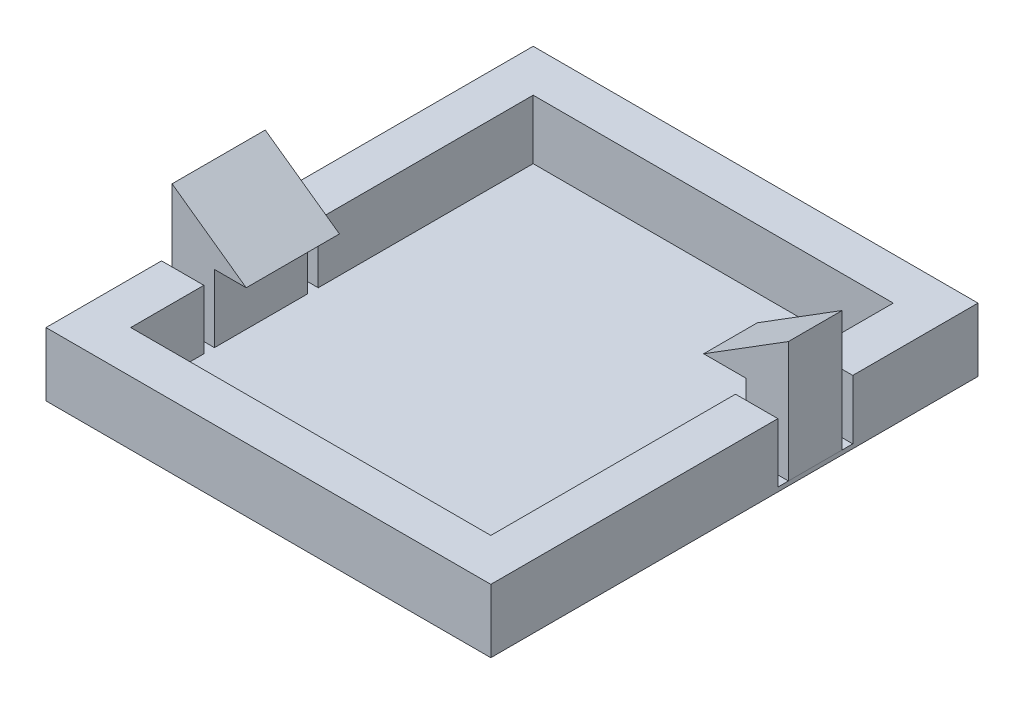
ISO-10303-21;
HEADER;
FILE_DESCRIPTION(('STEP AP214'),'2;1');
FILE_NAME('part.step','',(''),(''),'','','');
FILE_SCHEMA(('AUTOMOTIVE_DESIGN { 1 0 10303 214 1 1 1 1 }'));
ENDSEC;
DATA;
#1=APPLICATION_CONTEXT('core data for automotive mechanical design processes');
#2=APPLICATION_PROTOCOL_DEFINITION('international standard','automotive_design',2000,#1);
#3=PRODUCT_CONTEXT('',#1,'mechanical');
#4=PRODUCT('Part','Part','',(#3));
#5=PRODUCT_RELATED_PRODUCT_CATEGORY('part','',(#4));
#6=PRODUCT_DEFINITION_FORMATION('','',#4);
#7=PRODUCT_DEFINITION_CONTEXT('part definition',#1,'design');
#8=PRODUCT_DEFINITION('design','',#6,#7);
#9=PRODUCT_DEFINITION_SHAPE('','',#8);
#10=(LENGTH_UNIT() NAMED_UNIT(*) SI_UNIT(.MILLI.,.METRE.));
#11=(NAMED_UNIT(*) PLANE_ANGLE_UNIT() SI_UNIT($,.RADIAN.));
#12=(NAMED_UNIT(*) SI_UNIT($,.STERADIAN.) SOLID_ANGLE_UNIT());
#13=UNCERTAINTY_MEASURE_WITH_UNIT(LENGTH_MEASURE(1.E-05),#10,'distance_accuracy_value','');
#14=(GEOMETRIC_REPRESENTATION_CONTEXT(3) GLOBAL_UNCERTAINTY_ASSIGNED_CONTEXT((#13)) GLOBAL_UNIT_ASSIGNED_CONTEXT((#10,
#11,#12)) REPRESENTATION_CONTEXT('',''));
#15=CARTESIAN_POINT('',(0.,0.,0.));
#16=DIRECTION('',(0.,0.,1.));
#17=DIRECTION('',(1.,0.,0.));
#18=AXIS2_PLACEMENT_3D('',#15,#16,#17);
#19=CARTESIAN_POINT('',(0.,0.2,0.));
#20=DIRECTION('',(0.,1.,0.));
#21=DIRECTION('',(0.,0.,1.));
#22=AXIS2_PLACEMENT_3D('',#19,#20,#21);
#23=PLANE('',#22);
#24=DIRECTION('',(-1.,0.,0.));
#25=VECTOR('',#24,1.);
#26=CARTESIAN_POINT('',(-10.5010455856569,0.2,1.14755011022584));
#27=LINE('',#26,#25);
#28=CARTESIAN_POINT('',(-8.50104558565693,0.2,1.14755011022584));
#29=VERTEX_POINT('',#28);
#30=CARTESIAN_POINT('',(-10.5005227928285,0.2,1.14755011022584));
#31=VERTEX_POINT('',#30);
#32=EDGE_CURVE('E470',#29,#31,#27,.T.);
#33=ORIENTED_EDGE('',*,*,#32,.F.);
#34=DIRECTION('',(0.,0.,-1.));
#35=VECTOR('',#34,1.);
#36=CARTESIAN_POINT('',(-8.50104558565693,0.2,1.14755011022584));
#37=LINE('',#36,#35);
#38=CARTESIAN_POINT('',(-8.50104558565693,0.2,5.54648062378902));
#39=VERTEX_POINT('',#38);
#40=EDGE_CURVE('E466',#39,#29,#37,.T.);
#41=ORIENTED_EDGE('',*,*,#40,.F.);
#42=DIRECTION('',(1.,0.,0.));
#43=VECTOR('',#42,1.);
#44=CARTESIAN_POINT('',(-10.5010455856569,0.2,5.54648062378902));
#45=LINE('',#44,#43);
#46=CARTESIAN_POINT('',(-10.5005227928285,0.2,5.54648062378902));
#47=VERTEX_POINT('',#46);
#48=EDGE_CURVE('E469',#47,#39,#45,.T.);
#49=ORIENTED_EDGE('',*,*,#48,.F.);
#50=DIRECTION('',(0.,0.,1.));
#51=VECTOR('',#50,1.);
#52=CARTESIAN_POINT('',(-10.5,0.2,0.));
#53=LINE('',#52,#51);
#54=CARTESIAN_POINT('',(-10.5,0.2,6.04648062378904));
#55=VERTEX_POINT('',#54);
#56=EDGE_CURVE('E241',#47,#55,#53,.T.);
#57=ORIENTED_EDGE('',*,*,#56,.T.);
#58=DIRECTION('',(-1.,0.,0.));
#59=VECTOR('',#58,1.);
#60=CARTESIAN_POINT('',(-10.5,0.2,6.04648062378904));
#61=LINE('',#60,#59);
#62=CARTESIAN_POINT('',(-8.5,0.2,6.04648062378904));
#63=VERTEX_POINT('',#62);
#64=EDGE_CURVE('E275',#63,#55,#61,.T.);
#65=ORIENTED_EDGE('',*,*,#64,.F.);
#66=DIRECTION('',(0.,0.,-1.));
#67=VECTOR('',#66,1.);
#68=CARTESIAN_POINT('',(-8.5,0.2,9.5));
#69=LINE('',#68,#67);
#70=CARTESIAN_POINT('',(-8.5,0.2,9.5));
#71=VERTEX_POINT('',#70);
#72=EDGE_CURVE('E269',#71,#63,#69,.T.);
#73=ORIENTED_EDGE('',*,*,#72,.F.);
#74=DIRECTION('',(-1.,0.,0.));
#75=VECTOR('',#74,1.);
#76=CARTESIAN_POINT('',(-8.5,0.2,9.5));
#77=LINE('',#76,#75);
#78=CARTESIAN_POINT('',(8.5,0.2,9.5));
#79=VERTEX_POINT('',#78);
#80=EDGE_CURVE('E164',#79,#71,#77,.T.);
#81=ORIENTED_EDGE('',*,*,#80,.F.);
#82=DIRECTION('',(0.,0.,1.));
#83=VECTOR('',#82,1.);
#84=CARTESIAN_POINT('',(8.5,0.2,9.5));
#85=LINE('',#84,#83);
#86=CARTESIAN_POINT('',(8.5,0.2,-2.05191514655576));
#87=VERTEX_POINT('',#86);
#88=EDGE_CURVE('E270',#87,#79,#85,.T.);
#89=ORIENTED_EDGE('',*,*,#88,.F.);
#90=DIRECTION('',(-1.,0.,0.));
#91=VECTOR('',#90,1.);
#92=CARTESIAN_POINT('',(8.5,0.2,-2.05191514655576));
#93=LINE('',#92,#91);
#94=CARTESIAN_POINT('',(10.5,0.2,-2.05191514655576));
#95=VERTEX_POINT('',#94);
#96=EDGE_CURVE('E267',#95,#87,#93,.T.);
#97=ORIENTED_EDGE('',*,*,#96,.F.);
#98=DIRECTION('',(0.,0.,1.));
#99=VECTOR('',#98,1.);
#100=CARTESIAN_POINT('',(10.5,0.2,0.));
#101=LINE('',#100,#99);
#102=CARTESIAN_POINT('',(10.4982568853822,0.2,-2.55191514655576));
#103=VERTEX_POINT('',#102);
#104=EDGE_CURVE('E232',#95,#103,#101,.F.);
#105=ORIENTED_EDGE('',*,*,#104,.T.);
#106=DIRECTION('',(1.,0.,0.));
#107=VECTOR('',#106,1.);
#108=CARTESIAN_POINT('',(10.4965137707645,0.2,-2.55191514655575));
#109=LINE('',#108,#107);
#110=CARTESIAN_POINT('',(8.49651377076446,0.2,-2.55191514655575));
#111=VERTEX_POINT('',#110);
#112=EDGE_CURVE('E425',#111,#103,#109,.T.);
#113=ORIENTED_EDGE('',*,*,#112,.F.);
#114=DIRECTION('',(0.,0.,1.));
#115=VECTOR('',#114,1.);
#116=CARTESIAN_POINT('',(8.49651377076446,0.2,-5.08783442656546));
#117=LINE('',#116,#115);
#118=CARTESIAN_POINT('',(8.49651377076446,0.2,-5.08783442656546));
#119=VERTEX_POINT('',#118);
#120=EDGE_CURVE('E479',#119,#111,#117,.T.);
#121=ORIENTED_EDGE('',*,*,#120,.F.);
#122=DIRECTION('',(-1.,0.,0.));
#123=VECTOR('',#122,1.);
#124=CARTESIAN_POINT('',(10.4965137707645,0.2,-5.08783442656546));
#125=LINE('',#124,#123);
#126=CARTESIAN_POINT('',(10.4982568853822,0.2,-5.08783442656546));
#127=VERTEX_POINT('',#126);
#128=EDGE_CURVE('E481',#127,#119,#125,.T.);
#129=ORIENTED_EDGE('',*,*,#128,.F.);
#130=DIRECTION('',(0.,0.,1.));
#131=VECTOR('',#130,1.);
#132=CARTESIAN_POINT('',(10.5,0.2,0.));
#133=LINE('',#132,#131);
#134=CARTESIAN_POINT('',(10.5,0.2,-5.58783442656546));
#135=VERTEX_POINT('',#134);
#136=EDGE_CURVE('E240',#127,#135,#133,.F.);
#137=ORIENTED_EDGE('',*,*,#136,.T.);
#138=DIRECTION('',(-1.,0.,0.));
#139=VECTOR('',#138,1.);
#140=CARTESIAN_POINT('',(0.,0.2,-5.58783442656546));
#141=LINE('',#140,#139);
#142=CARTESIAN_POINT('',(8.5,0.2,-5.58783442656546));
#143=VERTEX_POINT('',#142);
#144=EDGE_CURVE('E11',#135,#143,#141,.T.);
#145=ORIENTED_EDGE('',*,*,#144,.T.);
#146=DIRECTION('',(0.,0.,-1.));
#147=VECTOR('',#146,1.);
#148=CARTESIAN_POINT('',(8.5,0.2,0.));
#149=LINE('',#148,#147);
#150=CARTESIAN_POINT('',(8.5,0.2,-9.5));
#151=VERTEX_POINT('',#150);
#152=EDGE_CURVE('E47',#143,#151,#149,.T.);
#153=ORIENTED_EDGE('',*,*,#152,.T.);
#154=DIRECTION('',(-1.,0.,0.));
#155=VECTOR('',#154,1.);
#156=CARTESIAN_POINT('',(0.,0.2,-9.5));
#157=LINE('',#156,#155);
#158=CARTESIAN_POINT('',(-8.5,0.2,-9.5));
#159=VERTEX_POINT('',#158);
#160=EDGE_CURVE('E146',#151,#159,#157,.T.);
#161=ORIENTED_EDGE('',*,*,#160,.T.);
#162=DIRECTION('',(0.,0.,1.));
#163=VECTOR('',#162,1.);
#164=CARTESIAN_POINT('',(-8.5,0.2,0.));
#165=LINE('',#164,#163);
#166=CARTESIAN_POINT('',(-8.5,0.2,0.647550110225836));
#167=VERTEX_POINT('',#166);
#168=EDGE_CURVE('E157',#159,#167,#165,.T.);
#169=ORIENTED_EDGE('',*,*,#168,.T.);
#170=DIRECTION('',(-1.,0.,0.));
#171=VECTOR('',#170,1.);
#172=CARTESIAN_POINT('',(0.,0.2,0.647550110225836));
#173=LINE('',#172,#171);
#174=CARTESIAN_POINT('',(-10.5,0.2,0.647550110225836));
#175=VERTEX_POINT('',#174);
#176=EDGE_CURVE('E82',#167,#175,#173,.T.);
#177=ORIENTED_EDGE('',*,*,#176,.T.);
#178=DIRECTION('',(0.,0.,1.));
#179=VECTOR('',#178,1.);
#180=CARTESIAN_POINT('',(-10.5,0.2,0.));
#181=LINE('',#180,#179);
#182=EDGE_CURVE('E242',#175,#31,#181,.T.);
#183=ORIENTED_EDGE('',*,*,#182,.T.);
#184=EDGE_LOOP('',(#33,#41,#49,#57,#65,#73,#81,#89,#97,#105,#113,#121,#129,#137,#145,#153,#161,
#169,#177,#183));
#185=FACE_BOUND('',#184,.T.);
#186=ADVANCED_FACE('F39',(#185),#23,.T.);
#187=CARTESIAN_POINT('',(-8.5,3.,9.5));
#188=DIRECTION('',(-1.,0.,0.));
#189=DIRECTION('',(0.,0.,1.));
#190=AXIS2_PLACEMENT_3D('',#187,#188,#189);
#191=PLANE('',#190);
#192=DIRECTION('',(0.,-1.,0.));
#193=VECTOR('',#192,1.);
#194=CARTESIAN_POINT('',(-8.5,3.,9.5));
#195=LINE('',#194,#193);
#196=CARTESIAN_POINT('',(-8.5,3.,9.5));
#197=VERTEX_POINT('',#196);
#198=EDGE_CURVE('E290',#197,#71,#195,.T.);
#199=ORIENTED_EDGE('',*,*,#198,.T.);
#200=ORIENTED_EDGE('',*,*,#72,.T.);
#201=DIRECTION('',(0.,-1.,0.));
#202=VECTOR('',#201,1.);
#203=CARTESIAN_POINT('',(-8.5,3.,6.04648062378904));
#204=LINE('',#203,#202);
#205=CARTESIAN_POINT('',(-8.5,3.,6.04648062378904));
#206=VERTEX_POINT('',#205);
#207=EDGE_CURVE('E272',#206,#63,#204,.T.);
#208=ORIENTED_EDGE('',*,*,#207,.F.);
#209=DIRECTION('',(0.,0.,-1.));
#210=VECTOR('',#209,1.);
#211=CARTESIAN_POINT('',(-8.5,3.,9.5));
#212=LINE('',#211,#210);
#213=EDGE_CURVE('E294',#197,#206,#212,.T.);
#214=ORIENTED_EDGE('',*,*,#213,.F.);
#215=EDGE_LOOP('',(#199,#200,#208,#214));
#216=FACE_BOUND('',#215,.T.);
#217=ADVANCED_FACE('F318',(#216),#191,.F.);
#218=CARTESIAN_POINT('',(-10.5,3.,6.04648062378904));
#219=DIRECTION('',(0.,0.,1.));
#220=DIRECTION('',(1.,0.,0.));
#221=AXIS2_PLACEMENT_3D('',#218,#219,#220);
#222=PLANE('',#221);
#223=ORIENTED_EDGE('',*,*,#207,.T.);
#224=ORIENTED_EDGE('',*,*,#64,.T.);
#225=DIRECTION('',(0.,-1.,0.));
#226=VECTOR('',#225,1.);
#227=CARTESIAN_POINT('',(-10.5,3.,6.04648062378904));
#228=LINE('',#227,#226);
#229=CARTESIAN_POINT('',(-10.5,3.,6.04648062378904));
#230=VERTEX_POINT('',#229);
#231=EDGE_CURVE('E210',#230,#55,#228,.T.);
#232=ORIENTED_EDGE('',*,*,#231,.F.);
#233=DIRECTION('',(-1.,0.,0.));
#234=VECTOR('',#233,1.);
#235=CARTESIAN_POINT('',(-10.5,3.,6.04648062378904));
#236=LINE('',#235,#234);
#237=EDGE_CURVE('E310',#206,#230,#236,.T.);
#238=ORIENTED_EDGE('',*,*,#237,.F.);
#239=EDGE_LOOP('',(#223,#224,#232,#238));
#240=FACE_BOUND('',#239,.T.);
#241=ADVANCED_FACE('F189',(#240),#222,.F.);
#242=CARTESIAN_POINT('',(-10.5,3.,11.5));
#243=DIRECTION('',(1.,0.,0.));
#244=DIRECTION('',(0.,0.,-1.));
#245=AXIS2_PLACEMENT_3D('',#242,#243,#244);
#246=PLANE('',#245);
#247=ORIENTED_EDGE('',*,*,#182,.F.);
#248=DIRECTION('',(0.,-1.,0.));
#249=VECTOR('',#248,1.);
#250=CARTESIAN_POINT('',(-10.5,3.,0.647550110225836));
#251=LINE('',#250,#249);
#252=CARTESIAN_POINT('',(-10.5,3.,0.647550110225836));
#253=VERTEX_POINT('',#252);
#254=EDGE_CURVE('E79',#253,#175,#251,.T.);
#255=ORIENTED_EDGE('',*,*,#254,.F.);
#256=DIRECTION('',(0.,0.,1.));
#257=VECTOR('',#256,1.);
#258=CARTESIAN_POINT('',(-10.5,3.,0.647550110225836));
#259=LINE('',#258,#257);
#260=CARTESIAN_POINT('',(-10.5,3.,-11.5));
#261=VERTEX_POINT('',#260);
#262=EDGE_CURVE('E330',#261,#253,#259,.T.);
#263=ORIENTED_EDGE('',*,*,#262,.F.);
#264=DIRECTION('',(0.,-1.,0.));
#265=VECTOR('',#264,1.);
#266=CARTESIAN_POINT('',(-10.5,0.2,-11.5));
#267=LINE('',#266,#265);
#268=CARTESIAN_POINT('',(-10.5,0.,-11.5));
#269=VERTEX_POINT('',#268);
#270=EDGE_CURVE('E237',#261,#269,#267,.T.);
#271=ORIENTED_EDGE('',*,*,#270,.T.);
#272=DIRECTION('',(0.,0.,1.));
#273=VECTOR('',#272,1.);
#274=CARTESIAN_POINT('',(-10.5,0.,11.5));
#275=LINE('',#274,#273);
#276=CARTESIAN_POINT('',(-10.5,0.,11.5));
#277=VERTEX_POINT('',#276);
#278=EDGE_CURVE('E170',#269,#277,#275,.T.);
#279=ORIENTED_EDGE('',*,*,#278,.T.);
#280=DIRECTION('',(0.,-1.,0.));
#281=VECTOR('',#280,1.);
#282=CARTESIAN_POINT('',(-10.5,3.,11.5));
#283=LINE('',#282,#281);
#284=CARTESIAN_POINT('',(-10.5,3.,11.5));
#285=VERTEX_POINT('',#284);
#286=EDGE_CURVE('E277',#285,#277,#283,.T.);
#287=ORIENTED_EDGE('',*,*,#286,.F.);
#288=DIRECTION('',(0.,0.,1.));
#289=VECTOR('',#288,1.);
#290=CARTESIAN_POINT('',(-10.5,3.,11.5));
#291=LINE('',#290,#289);
#292=EDGE_CURVE('E307',#230,#285,#291,.T.);
#293=ORIENTED_EDGE('',*,*,#292,.F.);
#294=ORIENTED_EDGE('',*,*,#231,.T.);
#295=ORIENTED_EDGE('',*,*,#56,.F.);
#296=CARTESIAN_POINT('',(-10.5010455856569,0.2,1.14755011022584));
#297=DIRECTION('',(0.,0.,1.));
#298=VECTOR('',#297,1.);
#299=LINE('',#296,#298);
#300=EDGE_CURVE('E235',#31,#47,#299,.T.);
#301=ORIENTED_EDGE('',*,*,#300,.F.);
#302=EDGE_LOOP('',(#247,#255,#263,#271,#279,#287,#293,#294,#295,#301));
#303=FACE_BOUND('',#302,.T.);
#304=ADVANCED_FACE('F176',(#303),#246,.F.);
#305=CARTESIAN_POINT('',(-10.5,3.,11.5));
#306=DIRECTION('',(0.,0.,-1.));
#307=DIRECTION('',(-1.,0.,0.));
#308=AXIS2_PLACEMENT_3D('',#305,#306,#307);
#309=PLANE('',#308);
#310=ORIENTED_EDGE('',*,*,#286,.T.);
#311=DIRECTION('',(1.,0.,0.));
#312=VECTOR('',#311,1.);
#313=CARTESIAN_POINT('',(-10.5,0.,11.5));
#314=LINE('',#313,#312);
#315=CARTESIAN_POINT('',(10.5,0.,11.5));
#316=VERTEX_POINT('',#315);
#317=EDGE_CURVE('E291',#277,#316,#314,.T.);
#318=ORIENTED_EDGE('',*,*,#317,.T.);
#319=DIRECTION('',(0.,-1.,0.));
#320=VECTOR('',#319,1.);
#321=CARTESIAN_POINT('',(10.5,3.,11.5));
#322=LINE('',#321,#320);
#323=CARTESIAN_POINT('',(10.5,3.,11.5));
#324=VERTEX_POINT('',#323);
#325=EDGE_CURVE('E276',#324,#316,#322,.T.);
#326=ORIENTED_EDGE('',*,*,#325,.F.);
#327=DIRECTION('',(1.,0.,0.));
#328=VECTOR('',#327,1.);
#329=CARTESIAN_POINT('',(-10.5,3.,11.5));
#330=LINE('',#329,#328);
#331=EDGE_CURVE('E304',#285,#324,#330,.T.);
#332=ORIENTED_EDGE('',*,*,#331,.F.);
#333=EDGE_LOOP('',(#310,#318,#326,#332));
#334=FACE_BOUND('',#333,.T.);
#335=ADVANCED_FACE('F188',(#334),#309,.F.);
#336=CARTESIAN_POINT('',(10.5,3.,11.5));
#337=DIRECTION('',(-1.,0.,0.));
#338=DIRECTION('',(0.,0.,1.));
#339=AXIS2_PLACEMENT_3D('',#336,#337,#338);
#340=PLANE('',#339);
#341=DIRECTION('',(0.,-1.,0.));
#342=VECTOR('',#341,1.);
#343=CARTESIAN_POINT('',(10.5,0.2,-11.5));
#344=LINE('',#343,#342);
#345=CARTESIAN_POINT('',(10.5,3.,-11.5));
#346=VERTEX_POINT('',#345);
#347=CARTESIAN_POINT('',(10.5,0.,-11.5));
#348=VERTEX_POINT('',#347);
#349=EDGE_CURVE('E264',#346,#348,#344,.T.);
#350=ORIENTED_EDGE('',*,*,#349,.F.);
#351=DIRECTION('',(0.,0.,-1.));
#352=VECTOR('',#351,1.);
#353=CARTESIAN_POINT('',(10.5,3.,-5.58783442656546));
#354=LINE('',#353,#352);
#355=CARTESIAN_POINT('',(10.5,3.,-5.58783442656546));
#356=VERTEX_POINT('',#355);
#357=EDGE_CURVE('E536',#356,#346,#354,.T.);
#358=ORIENTED_EDGE('',*,*,#357,.F.);
#359=DIRECTION('',(0.,-1.,0.));
#360=VECTOR('',#359,1.);
#361=CARTESIAN_POINT('',(10.5,3.,-5.58783442656546));
#362=LINE('',#361,#360);
#363=EDGE_CURVE('E223',#356,#135,#362,.T.);
#364=ORIENTED_EDGE('',*,*,#363,.T.);
#365=ORIENTED_EDGE('',*,*,#136,.F.);
#366=CARTESIAN_POINT('',(10.4965137707645,0.2,-2.55191514655575));
#367=DIRECTION('',(0.,0.,-1.));
#368=VECTOR('',#367,1.);
#369=LINE('',#366,#368);
#370=EDGE_CURVE('E224',#103,#127,#369,.T.);
#371=ORIENTED_EDGE('',*,*,#370,.F.);
#372=ORIENTED_EDGE('',*,*,#104,.F.);
#373=DIRECTION('',(0.,-1.,0.));
#374=VECTOR('',#373,1.);
#375=CARTESIAN_POINT('',(10.5,3.,-2.05191514655576));
#376=LINE('',#375,#374);
#377=CARTESIAN_POINT('',(10.5,3.,-2.05191514655576));
#378=VERTEX_POINT('',#377);
#379=EDGE_CURVE('E207',#378,#95,#376,.T.);
#380=ORIENTED_EDGE('',*,*,#379,.F.);
#381=DIRECTION('',(0.,0.,-1.));
#382=VECTOR('',#381,1.);
#383=CARTESIAN_POINT('',(10.5,3.,11.5));
#384=LINE('',#383,#382);
#385=EDGE_CURVE('E301',#324,#378,#384,.T.);
#386=ORIENTED_EDGE('',*,*,#385,.F.);
#387=ORIENTED_EDGE('',*,*,#325,.T.);
#388=DIRECTION('',(0.,0.,-1.));
#389=VECTOR('',#388,1.);
#390=CARTESIAN_POINT('',(10.5,0.,11.5));
#391=LINE('',#390,#389);
#392=EDGE_CURVE('E292',#316,#348,#391,.T.);
#393=ORIENTED_EDGE('',*,*,#392,.T.);
#394=EDGE_LOOP('',(#350,#358,#364,#365,#371,#372,#380,#386,#387,#393));
#395=FACE_BOUND('',#394,.T.);
#396=ADVANCED_FACE('F192',(#395),#340,.F.);
#397=CARTESIAN_POINT('',(8.5,3.,-2.05191514655576));
#398=DIRECTION('',(0.,0.,1.));
#399=DIRECTION('',(1.,0.,0.));
#400=AXIS2_PLACEMENT_3D('',#397,#398,#399);
#401=PLANE('',#400);
#402=ORIENTED_EDGE('',*,*,#379,.T.);
#403=ORIENTED_EDGE('',*,*,#96,.T.);
#404=DIRECTION('',(0.,-1.,0.));
#405=VECTOR('',#404,1.);
#406=CARTESIAN_POINT('',(8.5,3.,-2.05191514655576));
#407=LINE('',#406,#405);
#408=CARTESIAN_POINT('',(8.5,3.,-2.05191514655576));
#409=VERTEX_POINT('',#408);
#410=EDGE_CURVE('E282',#409,#87,#407,.T.);
#411=ORIENTED_EDGE('',*,*,#410,.F.);
#412=DIRECTION('',(-1.,0.,0.));
#413=VECTOR('',#412,1.);
#414=CARTESIAN_POINT('',(8.5,3.,-2.05191514655576));
#415=LINE('',#414,#413);
#416=EDGE_CURVE('E303',#378,#409,#415,.T.);
#417=ORIENTED_EDGE('',*,*,#416,.F.);
#418=EDGE_LOOP('',(#402,#403,#411,#417));
#419=FACE_BOUND('',#418,.T.);
#420=ADVANCED_FACE('F200',(#419),#401,.F.);
#421=CARTESIAN_POINT('',(8.5,3.,9.5));
#422=DIRECTION('',(1.,0.,0.));
#423=DIRECTION('',(0.,0.,-1.));
#424=AXIS2_PLACEMENT_3D('',#421,#422,#423);
#425=PLANE('',#424);
#426=ORIENTED_EDGE('',*,*,#410,.T.);
#427=ORIENTED_EDGE('',*,*,#88,.T.);
#428=DIRECTION('',(0.,-1.,0.));
#429=VECTOR('',#428,1.);
#430=CARTESIAN_POINT('',(8.5,3.,9.5));
#431=LINE('',#430,#429);
#432=CARTESIAN_POINT('',(8.5,3.,9.5));
#433=VERTEX_POINT('',#432);
#434=EDGE_CURVE('E284',#433,#79,#431,.T.);
#435=ORIENTED_EDGE('',*,*,#434,.F.);
#436=DIRECTION('',(0.,0.,1.));
#437=VECTOR('',#436,1.);
#438=CARTESIAN_POINT('',(8.5,3.,9.5));
#439=LINE('',#438,#437);
#440=EDGE_CURVE('E299',#409,#433,#439,.T.);
#441=ORIENTED_EDGE('',*,*,#440,.F.);
#442=EDGE_LOOP('',(#426,#427,#435,#441));
#443=FACE_BOUND('',#442,.T.);
#444=ADVANCED_FACE('F556',(#443),#425,.F.);
#445=CARTESIAN_POINT('',(-8.5,3.,9.5));
#446=DIRECTION('',(0.,0.,1.));
#447=DIRECTION('',(1.,0.,0.));
#448=AXIS2_PLACEMENT_3D('',#445,#446,#447);
#449=PLANE('',#448);
#450=ORIENTED_EDGE('',*,*,#434,.T.);
#451=ORIENTED_EDGE('',*,*,#80,.T.);
#452=ORIENTED_EDGE('',*,*,#198,.F.);
#453=DIRECTION('',(-1.,0.,0.));
#454=VECTOR('',#453,1.);
#455=CARTESIAN_POINT('',(-8.5,3.,9.5));
#456=LINE('',#455,#454);
#457=EDGE_CURVE('E289',#433,#197,#456,.T.);
#458=ORIENTED_EDGE('',*,*,#457,.F.);
#459=EDGE_LOOP('',(#450,#451,#452,#458));
#460=FACE_BOUND('',#459,.T.);
#461=ADVANCED_FACE('F565',(#460),#449,.F.);
#462=CARTESIAN_POINT('',(0.,3.,0.));
#463=DIRECTION('',(0.,-1.,0.));
#464=DIRECTION('',(0.,0.,-1.));
#465=AXIS2_PLACEMENT_3D('',#462,#463,#464);
#466=PLANE('',#465);
#467=ORIENTED_EDGE('',*,*,#213,.T.);
#468=ORIENTED_EDGE('',*,*,#237,.T.);
#469=ORIENTED_EDGE('',*,*,#292,.T.);
#470=ORIENTED_EDGE('',*,*,#331,.T.);
#471=ORIENTED_EDGE('',*,*,#385,.T.);
#472=ORIENTED_EDGE('',*,*,#416,.T.);
#473=ORIENTED_EDGE('',*,*,#440,.T.);
#474=ORIENTED_EDGE('',*,*,#457,.T.);
#475=EDGE_LOOP('',(#467,#468,#469,#470,#471,#472,#473,#474));
#476=FACE_BOUND('',#475,.T.);
#477=ADVANCED_FACE('F41',(#476),#466,.F.);
#478=CARTESIAN_POINT('',(0.,0.,0.));
#479=DIRECTION('',(0.,-1.,0.));
#480=DIRECTION('',(0.,0.,-1.));
#481=AXIS2_PLACEMENT_3D('',#478,#479,#480);
#482=PLANE('',#481);
#483=DIRECTION('',(-1.,0.,0.));
#484=VECTOR('',#483,1.);
#485=CARTESIAN_POINT('',(-10.5,0.,-11.5));
#486=LINE('',#485,#484);
#487=EDGE_CURVE('E246',#348,#269,#486,.T.);
#488=ORIENTED_EDGE('',*,*,#487,.F.);
#489=ORIENTED_EDGE('',*,*,#392,.F.);
#490=ORIENTED_EDGE('',*,*,#317,.F.);
#491=ORIENTED_EDGE('',*,*,#278,.F.);
#492=EDGE_LOOP('',(#488,#489,#490,#491));
#493=FACE_BOUND('',#492,.T.);
#494=ADVANCED_FACE('F548',(#493),#482,.T.);
#495=CARTESIAN_POINT('',(-10.5,0.2,-11.5));
#496=DIRECTION('',(0.,0.,1.));
#497=DIRECTION('',(1.,0.,0.));
#498=AXIS2_PLACEMENT_3D('',#495,#496,#497);
#499=PLANE('',#498);
#500=ORIENTED_EDGE('',*,*,#487,.T.);
#501=ORIENTED_EDGE('',*,*,#270,.F.);
#502=DIRECTION('',(-1.,0.,0.));
#503=VECTOR('',#502,1.);
#504=CARTESIAN_POINT('',(-10.5,3.,-11.5));
#505=LINE('',#504,#503);
#506=EDGE_CURVE('E338',#346,#261,#505,.T.);
#507=ORIENTED_EDGE('',*,*,#506,.F.);
#508=ORIENTED_EDGE('',*,*,#349,.T.);
#509=EDGE_LOOP('',(#500,#501,#507,#508));
#510=FACE_BOUND('',#509,.T.);
#511=ADVANCED_FACE('F541',(#510),#499,.F.);
#512=CARTESIAN_POINT('',(8.5,3.,-5.58783442656546));
#513=DIRECTION('',(1.,0.,0.));
#514=DIRECTION('',(0.,0.,-1.));
#515=AXIS2_PLACEMENT_3D('',#512,#513,#514);
#516=PLANE('',#515);
#517=ORIENTED_EDGE('',*,*,#152,.F.);
#518=DIRECTION('',(0.,-1.,0.));
#519=VECTOR('',#518,1.);
#520=CARTESIAN_POINT('',(8.5,3.,-5.58783442656546));
#521=LINE('',#520,#519);
#522=CARTESIAN_POINT('',(8.5,3.,-5.58783442656546));
#523=VERTEX_POINT('',#522);
#524=EDGE_CURVE('E251',#523,#143,#521,.T.);
#525=ORIENTED_EDGE('',*,*,#524,.F.);
#526=DIRECTION('',(0.,0.,1.));
#527=VECTOR('',#526,1.);
#528=CARTESIAN_POINT('',(8.5,3.,-5.58783442656546));
#529=LINE('',#528,#527);
#530=CARTESIAN_POINT('',(8.5,3.,-9.5));
#531=VERTEX_POINT('',#530);
#532=EDGE_CURVE('E346',#531,#523,#529,.T.);
#533=ORIENTED_EDGE('',*,*,#532,.F.);
#534=DIRECTION('',(0.,-1.,0.));
#535=VECTOR('',#534,1.);
#536=CARTESIAN_POINT('',(8.5,3.,-9.5));
#537=LINE('',#536,#535);
#538=EDGE_CURVE('E156',#531,#151,#537,.T.);
#539=ORIENTED_EDGE('',*,*,#538,.T.);
#540=EDGE_LOOP('',(#517,#525,#533,#539));
#541=FACE_BOUND('',#540,.T.);
#542=ADVANCED_FACE('F344',(#541),#516,.F.);
#543=CARTESIAN_POINT('',(8.5,3.,-5.58783442656546));
#544=DIRECTION('',(0.,0.,-1.));
#545=DIRECTION('',(-1.,0.,0.));
#546=AXIS2_PLACEMENT_3D('',#543,#544,#545);
#547=PLANE('',#546);
#548=ORIENTED_EDGE('',*,*,#144,.F.);
#549=ORIENTED_EDGE('',*,*,#363,.F.);
#550=DIRECTION('',(1.,0.,0.));
#551=VECTOR('',#550,1.);
#552=CARTESIAN_POINT('',(8.5,3.,-5.58783442656546));
#553=LINE('',#552,#551);
#554=EDGE_CURVE('E534',#523,#356,#553,.T.);
#555=ORIENTED_EDGE('',*,*,#554,.F.);
#556=ORIENTED_EDGE('',*,*,#524,.T.);
#557=EDGE_LOOP('',(#548,#549,#555,#556));
#558=FACE_BOUND('',#557,.T.);
#559=ADVANCED_FACE('F616',(#558),#547,.F.);
#560=CARTESIAN_POINT('',(-10.5,3.,0.647550110225836));
#561=DIRECTION('',(0.,0.,-1.));
#562=DIRECTION('',(-1.,0.,0.));
#563=AXIS2_PLACEMENT_3D('',#560,#561,#562);
#564=PLANE('',#563);
#565=ORIENTED_EDGE('',*,*,#176,.F.);
#566=DIRECTION('',(0.,-1.,0.));
#567=VECTOR('',#566,1.);
#568=CARTESIAN_POINT('',(-8.5,3.,0.647550110225836));
#569=LINE('',#568,#567);
#570=CARTESIAN_POINT('',(-8.5,3.,0.647550110225836));
#571=VERTEX_POINT('',#570);
#572=EDGE_CURVE('E154',#571,#167,#569,.T.);
#573=ORIENTED_EDGE('',*,*,#572,.F.);
#574=DIRECTION('',(1.,0.,0.));
#575=VECTOR('',#574,1.);
#576=CARTESIAN_POINT('',(-10.5,3.,0.647550110225836));
#577=LINE('',#576,#575);
#578=EDGE_CURVE('E332',#253,#571,#577,.T.);
#579=ORIENTED_EDGE('',*,*,#578,.F.);
#580=ORIENTED_EDGE('',*,*,#254,.T.);
#581=EDGE_LOOP('',(#565,#573,#579,#580));
#582=FACE_BOUND('',#581,.T.);
#583=ADVANCED_FACE('F335',(#582),#564,.F.);
#584=CARTESIAN_POINT('',(-8.5,3.,0.647550110225836));
#585=DIRECTION('',(-1.,0.,0.));
#586=DIRECTION('',(0.,0.,1.));
#587=AXIS2_PLACEMENT_3D('',#584,#585,#586);
#588=PLANE('',#587);
#589=ORIENTED_EDGE('',*,*,#168,.F.);
#590=DIRECTION('',(0.,-1.,0.));
#591=VECTOR('',#590,1.);
#592=CARTESIAN_POINT('',(-8.5,3.,-9.5));
#593=LINE('',#592,#591);
#594=CARTESIAN_POINT('',(-8.5,3.,-9.5));
#595=VERTEX_POINT('',#594);
#596=EDGE_CURVE('E141',#595,#159,#593,.T.);
#597=ORIENTED_EDGE('',*,*,#596,.F.);
#598=DIRECTION('',(0.,0.,-1.));
#599=VECTOR('',#598,1.);
#600=CARTESIAN_POINT('',(-8.5,3.,0.647550110225836));
#601=LINE('',#600,#599);
#602=EDGE_CURVE('E333',#571,#595,#601,.T.);
#603=ORIENTED_EDGE('',*,*,#602,.F.);
#604=ORIENTED_EDGE('',*,*,#572,.T.);
#605=EDGE_LOOP('',(#589,#597,#603,#604));
#606=FACE_BOUND('',#605,.T.);
#607=ADVANCED_FACE('F159',(#606),#588,.F.);
#608=CARTESIAN_POINT('',(-8.5,3.,-9.5));
#609=DIRECTION('',(0.,0.,-1.));
#610=DIRECTION('',(-1.,0.,0.));
#611=AXIS2_PLACEMENT_3D('',#608,#609,#610);
#612=PLANE('',#611);
#613=ORIENTED_EDGE('',*,*,#160,.F.);
#614=ORIENTED_EDGE('',*,*,#538,.F.);
#615=DIRECTION('',(1.,0.,0.));
#616=VECTOR('',#615,1.);
#617=CARTESIAN_POINT('',(-8.5,3.,-9.5));
#618=LINE('',#617,#616);
#619=EDGE_CURVE('E155',#595,#531,#618,.T.);
#620=ORIENTED_EDGE('',*,*,#619,.F.);
#621=ORIENTED_EDGE('',*,*,#596,.T.);
#622=EDGE_LOOP('',(#613,#614,#620,#621));
#623=FACE_BOUND('',#622,.T.);
#624=ADVANCED_FACE('F144',(#623),#612,.F.);
#625=CARTESIAN_POINT('',(0.,3.,0.));
#626=DIRECTION('',(0.,-1.,0.));
#627=DIRECTION('',(0.,0.,-1.));
#628=AXIS2_PLACEMENT_3D('',#625,#626,#627);
#629=PLANE('',#628);
#630=ORIENTED_EDGE('',*,*,#532,.T.);
#631=ORIENTED_EDGE('',*,*,#554,.T.);
#632=ORIENTED_EDGE('',*,*,#357,.T.);
#633=ORIENTED_EDGE('',*,*,#506,.T.);
#634=ORIENTED_EDGE('',*,*,#262,.T.);
#635=ORIENTED_EDGE('',*,*,#578,.T.);
#636=ORIENTED_EDGE('',*,*,#602,.T.);
#637=ORIENTED_EDGE('',*,*,#619,.T.);
#638=EDGE_LOOP('',(#630,#631,#632,#633,#634,#635,#636,#637));
#639=FACE_BOUND('',#638,.T.);
#640=ADVANCED_FACE('F506',(#639),#629,.F.);
#641=CARTESIAN_POINT('',(10.4965137707645,3.4,-5.08783442656546));
#642=DIRECTION('',(-1.,0.,0.));
#643=DIRECTION('',(0.,0.,1.));
#644=AXIS2_PLACEMENT_3D('',#641,#642,#643);
#645=PLANE('',#644);
#646=ORIENTED_EDGE('',*,*,#370,.T.);
#647=DIRECTION('',(0.,-1.,0.));
#648=VECTOR('',#647,1.);
#649=CARTESIAN_POINT('',(10.4965137707645,3.4,-5.08783442656546));
#650=LINE('',#649,#648);
#651=CARTESIAN_POINT('',(10.4965137707645,5.9,-5.08783442656547));
#652=VERTEX_POINT('',#651);
#653=EDGE_CURVE('E429',#652,#127,#650,.T.);
#654=ORIENTED_EDGE('',*,*,#653,.F.);
#655=DIRECTION('',(0.,0.,1.));
#656=VECTOR('',#655,1.);
#657=CARTESIAN_POINT('',(10.4965137707645,5.9,-9.80482499259376));
#658=LINE('',#657,#656);
#659=CARTESIAN_POINT('',(10.4965137707645,5.9,-2.55191514655575));
#660=VERTEX_POINT('',#659);
#661=EDGE_CURVE('E428',#652,#660,#658,.T.);
#662=ORIENTED_EDGE('',*,*,#661,.T.);
#663=DIRECTION('',(0.,-1.,0.));
#664=VECTOR('',#663,1.);
#665=CARTESIAN_POINT('',(10.4965137707645,3.4,-2.55191514655575));
#666=LINE('',#665,#664);
#667=EDGE_CURVE('E412',#660,#103,#666,.T.);
#668=ORIENTED_EDGE('',*,*,#667,.T.);
#669=EDGE_LOOP('',(#646,#654,#662,#668));
#670=FACE_BOUND('',#669,.T.);
#671=ADVANCED_FACE('F427',(#670),#645,.F.);
#672=CARTESIAN_POINT('',(10.4965137707645,3.4,-5.08783442656546));
#673=DIRECTION('',(0.,0.,1.));
#674=DIRECTION('',(1.,0.,0.));
#675=AXIS2_PLACEMENT_3D('',#672,#673,#674);
#676=PLANE('',#675);
#677=ORIENTED_EDGE('',*,*,#128,.T.);
#678=DIRECTION('',(0.,-1.,0.));
#679=VECTOR('',#678,1.);
#680=CARTESIAN_POINT('',(8.49651377076446,3.4,-5.08783442656546));
#681=LINE('',#680,#679);
#682=CARTESIAN_POINT('',(8.49651377076446,3.4,-5.08783442656546));
#683=VERTEX_POINT('',#682);
#684=EDGE_CURVE('E478',#683,#119,#681,.T.);
#685=ORIENTED_EDGE('',*,*,#684,.F.);
#686=DIRECTION('',(-1.,0.,0.));
#687=VECTOR('',#686,1.);
#688=CARTESIAN_POINT('',(6.49651377076446,3.4,-5.08783442656546));
#689=LINE('',#688,#687);
#690=CARTESIAN_POINT('',(6.49651377076446,3.4,-5.08783442656546));
#691=VERTEX_POINT('',#690);
#692=EDGE_CURVE('E452',#683,#691,#689,.T.);
#693=ORIENTED_EDGE('',*,*,#692,.T.);
#694=DIRECTION('',(0.847998304005088,0.52999894000318,0.));
#695=VECTOR('',#694,1.);
#696=CARTESIAN_POINT('',(10.4965137707645,5.9,-5.08783442656546));
#697=LINE('',#696,#695);
#698=EDGE_CURVE('E441',#691,#652,#697,.T.);
#699=ORIENTED_EDGE('',*,*,#698,.T.);
#700=ORIENTED_EDGE('',*,*,#653,.T.);
#701=EDGE_LOOP('',(#677,#685,#693,#699,#700));
#702=FACE_BOUND('',#701,.T.);
#703=ADVANCED_FACE('F510',(#702),#676,.F.);
#704=CARTESIAN_POINT('',(8.49651377076446,3.4,-5.08783442656546));
#705=DIRECTION('',(1.,0.,0.));
#706=DIRECTION('',(0.,0.,-1.));
#707=AXIS2_PLACEMENT_3D('',#704,#705,#706);
#708=PLANE('',#707);
#709=ORIENTED_EDGE('',*,*,#120,.T.);
#710=DIRECTION('',(0.,-1.,0.));
#711=VECTOR('',#710,1.);
#712=CARTESIAN_POINT('',(8.49651377076446,3.4,-2.55191514655575));
#713=LINE('',#712,#711);
#714=CARTESIAN_POINT('',(8.49651377076446,3.4,-2.55191514655575));
#715=VERTEX_POINT('',#714);
#716=EDGE_CURVE('E422',#715,#111,#713,.T.);
#717=ORIENTED_EDGE('',*,*,#716,.F.);
#718=DIRECTION('',(0.,0.,1.));
#719=VECTOR('',#718,1.);
#720=CARTESIAN_POINT('',(8.49651377076446,3.4,-5.08783442656546));
#721=LINE('',#720,#719);
#722=EDGE_CURVE('E424',#683,#715,#721,.T.);
#723=ORIENTED_EDGE('',*,*,#722,.F.);
#724=ORIENTED_EDGE('',*,*,#684,.T.);
#725=EDGE_LOOP('',(#709,#717,#723,#724));
#726=FACE_BOUND('',#725,.T.);
#727=ADVANCED_FACE('F567',(#726),#708,.F.);
#728=CARTESIAN_POINT('',(10.4965137707645,3.4,-2.55191514655575));
#729=DIRECTION('',(0.,0.,-1.));
#730=DIRECTION('',(-1.,0.,0.));
#731=AXIS2_PLACEMENT_3D('',#728,#729,#730);
#732=PLANE('',#731);
#733=ORIENTED_EDGE('',*,*,#112,.T.);
#734=ORIENTED_EDGE('',*,*,#667,.F.);
#735=DIRECTION('',(-0.847998304005088,-0.52999894000318,0.));
#736=VECTOR('',#735,1.);
#737=CARTESIAN_POINT('',(10.4965137707645,5.9,-2.55191514655575));
#738=LINE('',#737,#736);
#739=CARTESIAN_POINT('',(6.49651377076446,3.4,-2.55191514655575));
#740=VERTEX_POINT('',#739);
#741=EDGE_CURVE('E420',#660,#740,#738,.T.);
#742=ORIENTED_EDGE('',*,*,#741,.T.);
#743=DIRECTION('',(1.,0.,0.));
#744=VECTOR('',#743,1.);
#745=CARTESIAN_POINT('',(6.49651377076446,3.4,-2.55191514655575));
#746=LINE('',#745,#744);
#747=EDGE_CURVE('E438',#740,#715,#746,.T.);
#748=ORIENTED_EDGE('',*,*,#747,.T.);
#749=ORIENTED_EDGE('',*,*,#716,.T.);
#750=EDGE_LOOP('',(#733,#734,#742,#748,#749));
#751=FACE_BOUND('',#750,.T.);
#752=ADVANCED_FACE('F418',(#751),#732,.F.);
#753=CARTESIAN_POINT('',(-10.5010455856569,3.4,1.14755011022584));
#754=DIRECTION('',(1.,0.,0.));
#755=DIRECTION('',(0.,0.,-1.));
#756=AXIS2_PLACEMENT_3D('',#753,#754,#755);
#757=PLANE('',#756);
#758=ORIENTED_EDGE('',*,*,#300,.T.);
#759=DIRECTION('',(0.,-1.,0.));
#760=VECTOR('',#759,1.);
#761=CARTESIAN_POINT('',(-10.5010455856569,3.4,5.54648062378902));
#762=LINE('',#761,#760);
#763=CARTESIAN_POINT('',(-10.5010455856569,5.9,5.54648062378902));
#764=VERTEX_POINT('',#763);
#765=EDGE_CURVE('E474',#764,#47,#762,.T.);
#766=ORIENTED_EDGE('',*,*,#765,.F.);
#767=DIRECTION('',(0.,0.,1.));
#768=VECTOR('',#767,1.);
#769=CARTESIAN_POINT('',(-10.5010455856569,5.9,-3.15361252329548));
#770=LINE('',#769,#768);
#771=CARTESIAN_POINT('',(-10.5010455856569,5.9,1.14755011022584));
#772=VERTEX_POINT('',#771);
#773=EDGE_CURVE('E446',#772,#764,#770,.T.);
#774=ORIENTED_EDGE('',*,*,#773,.F.);
#775=DIRECTION('',(0.,-1.,0.));
#776=VECTOR('',#775,1.);
#777=CARTESIAN_POINT('',(-10.5010455856569,3.4,1.14755011022584));
#778=LINE('',#777,#776);
#779=EDGE_CURVE('E468',#772,#31,#778,.T.);
#780=ORIENTED_EDGE('',*,*,#779,.T.);
#781=EDGE_LOOP('',(#758,#766,#774,#780));
#782=FACE_BOUND('',#781,.T.);
#783=ADVANCED_FACE('F495',(#782),#757,.F.);
#784=CARTESIAN_POINT('',(-10.5010455856569,3.4,5.54648062378902));
#785=DIRECTION('',(0.,0.,-1.));
#786=DIRECTION('',(-1.,0.,0.));
#787=AXIS2_PLACEMENT_3D('',#784,#785,#786);
#788=PLANE('',#787);
#789=ORIENTED_EDGE('',*,*,#48,.T.);
#790=DIRECTION('',(0.,-1.,0.));
#791=VECTOR('',#790,1.);
#792=CARTESIAN_POINT('',(-8.50104558565693,3.4,5.54648062378902));
#793=LINE('',#792,#791);
#794=CARTESIAN_POINT('',(-8.50104558565693,3.4,5.54648062378902));
#795=VERTEX_POINT('',#794);
#796=EDGE_CURVE('E59',#795,#39,#793,.T.);
#797=ORIENTED_EDGE('',*,*,#796,.F.);
#798=DIRECTION('',(1.,0.,0.));
#799=VECTOR('',#798,1.);
#800=CARTESIAN_POINT('',(-7.00104558565693,3.4,5.54648062378902));
#801=LINE('',#800,#799);
#802=CARTESIAN_POINT('',(-7.00104558565693,3.4,5.54648062378902));
#803=VERTEX_POINT('',#802);
#804=EDGE_CURVE('E453',#795,#803,#801,.T.);
#805=ORIENTED_EDGE('',*,*,#804,.T.);
#806=DIRECTION('',(-0.813733471206735,0.581238193719096,0.));
#807=VECTOR('',#806,1.);
#808=CARTESIAN_POINT('',(-10.5010455856569,5.9,5.54648062378902));
#809=LINE('',#808,#807);
#810=EDGE_CURVE('E451',#803,#764,#809,.T.);
#811=ORIENTED_EDGE('',*,*,#810,.T.);
#812=ORIENTED_EDGE('',*,*,#765,.T.);
#813=EDGE_LOOP('',(#789,#797,#805,#811,#812));
#814=FACE_BOUND('',#813,.T.);
#815=ADVANCED_FACE('F505',(#814),#788,.F.);
#816=CARTESIAN_POINT('',(-8.50104558565693,3.4,1.14755011022584));
#817=DIRECTION('',(-1.,0.,0.));
#818=DIRECTION('',(0.,0.,1.));
#819=AXIS2_PLACEMENT_3D('',#816,#817,#818);
#820=PLANE('',#819);
#821=ORIENTED_EDGE('',*,*,#40,.T.);
#822=DIRECTION('',(0.,-1.,0.));
#823=VECTOR('',#822,1.);
#824=CARTESIAN_POINT('',(-8.50104558565693,3.4,1.14755011022584));
#825=LINE('',#824,#823);
#826=CARTESIAN_POINT('',(-8.50104558565693,3.4,1.14755011022584));
#827=VERTEX_POINT('',#826);
#828=EDGE_CURVE('E473',#827,#29,#825,.T.);
#829=ORIENTED_EDGE('',*,*,#828,.F.);
#830=DIRECTION('',(0.,0.,-1.));
#831=VECTOR('',#830,1.);
#832=CARTESIAN_POINT('',(-8.50104558565693,3.4,1.14755011022584));
#833=LINE('',#832,#831);
#834=EDGE_CURVE('E463',#795,#827,#833,.T.);
#835=ORIENTED_EDGE('',*,*,#834,.F.);
#836=ORIENTED_EDGE('',*,*,#796,.T.);
#837=EDGE_LOOP('',(#821,#829,#835,#836));
#838=FACE_BOUND('',#837,.T.);
#839=ADVANCED_FACE('F594',(#838),#820,.F.);
#840=CARTESIAN_POINT('',(-10.5010455856569,3.4,1.14755011022584));
#841=DIRECTION('',(0.,0.,1.));
#842=DIRECTION('',(1.,0.,0.));
#843=AXIS2_PLACEMENT_3D('',#840,#841,#842);
#844=PLANE('',#843);
#845=ORIENTED_EDGE('',*,*,#32,.T.);
#846=ORIENTED_EDGE('',*,*,#779,.F.);
#847=DIRECTION('',(0.813733471206735,-0.581238193719096,0.));
#848=VECTOR('',#847,1.);
#849=CARTESIAN_POINT('',(-10.5010455856569,5.9,1.14755011022584));
#850=LINE('',#849,#848);
#851=CARTESIAN_POINT('',(-7.00104558565693,3.4,1.14755011022584));
#852=VERTEX_POINT('',#851);
#853=EDGE_CURVE('E449',#772,#852,#850,.T.);
#854=ORIENTED_EDGE('',*,*,#853,.T.);
#855=DIRECTION('',(-1.,0.,0.));
#856=VECTOR('',#855,1.);
#857=CARTESIAN_POINT('',(-7.00104558565693,3.4,1.14755011022584));
#858=LINE('',#857,#856);
#859=EDGE_CURVE('E447',#852,#827,#858,.T.);
#860=ORIENTED_EDGE('',*,*,#859,.T.);
#861=ORIENTED_EDGE('',*,*,#828,.T.);
#862=EDGE_LOOP('',(#845,#846,#854,#860,#861));
#863=FACE_BOUND('',#862,.T.);
#864=ADVANCED_FACE('F591',(#863),#844,.F.);
#865=CARTESIAN_POINT('',(-7.00104558565693,3.4,-3.15361252329548));
#866=DIRECTION('',(0.,-1.,0.));
#867=DIRECTION('',(1.,0.,0.));
#868=AXIS2_PLACEMENT_3D('',#865,#866,#867);
#869=PLANE('',#868);
#870=ORIENTED_EDGE('',*,*,#804,.F.);
#871=ORIENTED_EDGE('',*,*,#834,.T.);
#872=ORIENTED_EDGE('',*,*,#859,.F.);
#873=DIRECTION('',(0.,0.,1.));
#874=VECTOR('',#873,1.);
#875=CARTESIAN_POINT('',(-7.00104558565693,3.4,-3.15361252329548));
#876=LINE('',#875,#874);
#877=EDGE_CURVE('E460',#852,#803,#876,.T.);
#878=ORIENTED_EDGE('',*,*,#877,.T.);
#879=EDGE_LOOP('',(#870,#871,#872,#878));
#880=FACE_BOUND('',#879,.T.);
#881=ADVANCED_FACE('F592',(#880),#869,.T.);
#882=CARTESIAN_POINT('',(-10.5010455856569,5.9,-3.15361252329548));
#883=DIRECTION('',(0.581238193719096,0.813733471206735,0.));
#884=DIRECTION('',(-0.813733471206735,0.581238193719096,0.));
#885=AXIS2_PLACEMENT_3D('',#882,#883,#884);
#886=PLANE('',#885);
#887=ORIENTED_EDGE('',*,*,#853,.F.);
#888=ORIENTED_EDGE('',*,*,#773,.T.);
#889=ORIENTED_EDGE('',*,*,#810,.F.);
#890=ORIENTED_EDGE('',*,*,#877,.F.);
#891=EDGE_LOOP('',(#887,#888,#889,#890));
#892=FACE_BOUND('',#891,.T.);
#893=ADVANCED_FACE('F590',(#892),#886,.T.);
#894=CARTESIAN_POINT('',(6.49651377076446,3.4,-9.80482499259376));
#895=DIRECTION('',(0.,-1.,0.));
#896=DIRECTION('',(0.,0.,-1.));
#897=AXIS2_PLACEMENT_3D('',#894,#895,#896);
#898=PLANE('',#897);
#899=ORIENTED_EDGE('',*,*,#692,.F.);
#900=ORIENTED_EDGE('',*,*,#722,.T.);
#901=ORIENTED_EDGE('',*,*,#747,.F.);
#902=DIRECTION('',(0.,0.,1.));
#903=VECTOR('',#902,1.);
#904=CARTESIAN_POINT('',(6.49651377076446,3.4,-9.80482499259376));
#905=LINE('',#904,#903);
#906=EDGE_CURVE('E432',#691,#740,#905,.T.);
#907=ORIENTED_EDGE('',*,*,#906,.F.);
#908=EDGE_LOOP('',(#899,#900,#901,#907));
#909=FACE_BOUND('',#908,.T.);
#910=ADVANCED_FACE('F568',(#909),#898,.T.);
#911=CARTESIAN_POINT('',(10.4965137707645,5.9,-9.80482499259376));
#912=DIRECTION('',(-0.52999894000318,0.847998304005088,0.));
#913=DIRECTION('',(-0.847998304005088,-0.52999894000318,0.));
#914=AXIS2_PLACEMENT_3D('',#911,#912,#913);
#915=PLANE('',#914);
#916=ORIENTED_EDGE('',*,*,#698,.F.);
#917=ORIENTED_EDGE('',*,*,#906,.T.);
#918=ORIENTED_EDGE('',*,*,#741,.F.);
#919=ORIENTED_EDGE('',*,*,#661,.F.);
#920=EDGE_LOOP('',(#916,#917,#918,#919));
#921=FACE_BOUND('',#920,.T.);
#922=ADVANCED_FACE('F436',(#921),#915,.T.);
#923=CLOSED_SHELL('',(#186,#217,#241,#304,#335,#396,#420,#444,#461,#477,#494,#511,#542,#559,
#583,#607,#624,#640,#671,#703,#727,#752,#783,#815,#839,#864,#881,#893,#910,#922));
#924=MANIFOLD_SOLID_BREP('B2',#923);
#925=ADVANCED_BREP_SHAPE_REPRESENTATION('',(#18,#924),#14);
#926=SHAPE_DEFINITION_REPRESENTATION(#9,#925);
ENDSEC;
END-ISO-10303-21;
